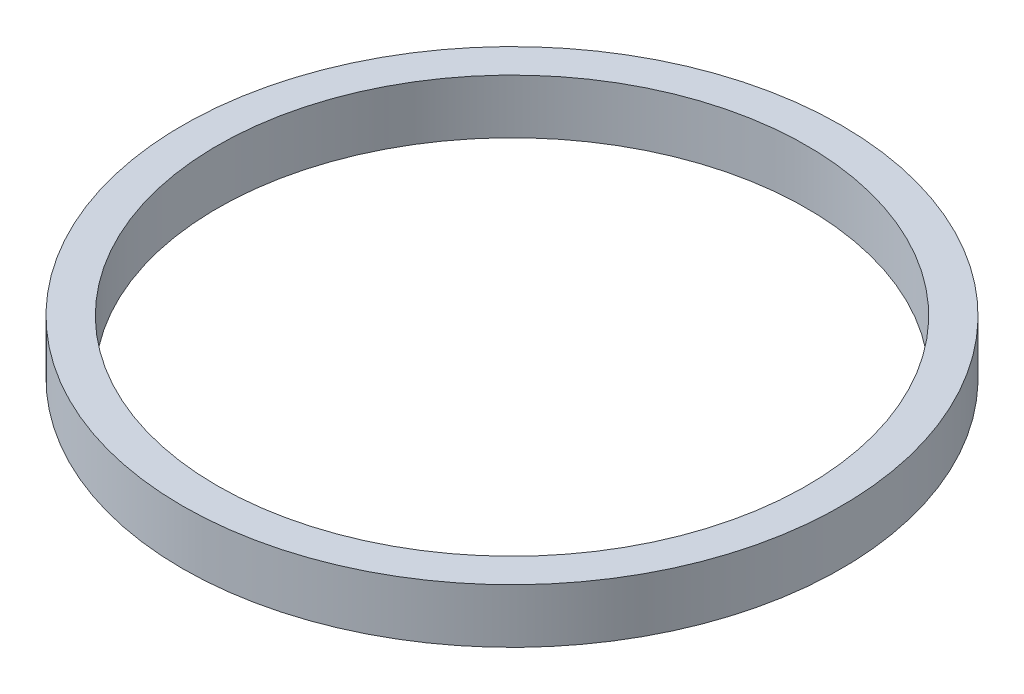
ISO-10303-21;
HEADER;
FILE_DESCRIPTION(('STEP AP214'),'2;1');
FILE_NAME('part.step','',(''),(''),'','','');
FILE_SCHEMA(('AUTOMOTIVE_DESIGN { 1 0 10303 214 1 1 1 1 }'));
ENDSEC;
DATA;
#1=APPLICATION_CONTEXT('core data for automotive mechanical design processes');
#2=APPLICATION_PROTOCOL_DEFINITION('international standard','automotive_design',2000,#1);
#3=PRODUCT_CONTEXT('',#1,'mechanical');
#4=PRODUCT('Part','Part','',(#3));
#5=PRODUCT_RELATED_PRODUCT_CATEGORY('part','',(#4));
#6=PRODUCT_DEFINITION_FORMATION('','',#4);
#7=PRODUCT_DEFINITION_CONTEXT('part definition',#1,'design');
#8=PRODUCT_DEFINITION('design','',#6,#7);
#9=PRODUCT_DEFINITION_SHAPE('','',#8);
#10=(LENGTH_UNIT() NAMED_UNIT(*) SI_UNIT(.MILLI.,.METRE.));
#11=(NAMED_UNIT(*) PLANE_ANGLE_UNIT() SI_UNIT($,.RADIAN.));
#12=(NAMED_UNIT(*) SI_UNIT($,.STERADIAN.) SOLID_ANGLE_UNIT());
#13=UNCERTAINTY_MEASURE_WITH_UNIT(LENGTH_MEASURE(1.E-05),#10,'distance_accuracy_value','');
#14=(GEOMETRIC_REPRESENTATION_CONTEXT(3) GLOBAL_UNCERTAINTY_ASSIGNED_CONTEXT((#13)) GLOBAL_UNIT_ASSIGNED_CONTEXT((#10,
#11,#12)) REPRESENTATION_CONTEXT('',''));
#15=CARTESIAN_POINT('',(0.,0.,0.));
#16=DIRECTION('',(0.,0.,1.));
#17=DIRECTION('',(1.,0.,0.));
#18=AXIS2_PLACEMENT_3D('',#15,#16,#17);
#19=CARTESIAN_POINT('',(0.,7.,0.));
#20=DIRECTION('',(0.,1.,0.));
#21=DIRECTION('',(0.,0.,1.));
#22=AXIS2_PLACEMENT_3D('',#19,#20,#21);
#23=PLANE('',#22);
#24=CARTESIAN_POINT('',(0.,7.,0.));
#25=DIRECTION('',(0.,1.,0.));
#26=DIRECTION('',(0.,0.,1.));
#27=AXIS2_PLACEMENT_3D('',#24,#25,#26);
#28=CIRCLE('',#27,42.5);
#29=CARTESIAN_POINT('',(0.,7.,42.5));
#30=VERTEX_POINT('',#29);
#31=EDGE_CURVE('E10',#30,#30,#28,.T.);
#32=ORIENTED_EDGE('',*,*,#31,.T.);
#33=EDGE_LOOP('',(#32));
#34=FACE_BOUND('',#33,.T.);
#35=CARTESIAN_POINT('',(0.,7.,0.));
#36=DIRECTION('',(0.,1.,0.));
#37=DIRECTION('',(0.,0.,1.));
#38=AXIS2_PLACEMENT_3D('',#35,#36,#37);
#39=CIRCLE('',#38,38.);
#40=CARTESIAN_POINT('',(0.,7.,38.));
#41=VERTEX_POINT('',#40);
#42=EDGE_CURVE('E46',#41,#41,#39,.T.);
#43=ORIENTED_EDGE('',*,*,#42,.F.);
#44=EDGE_LOOP('',(#43));
#45=FACE_BOUND('',#44,.T.);
#46=ADVANCED_FACE('F35',(#34,#45),#23,.T.);
#47=CARTESIAN_POINT('',(0.,0.,0.));
#48=DIRECTION('',(0.,1.,0.));
#49=DIRECTION('',(0.,0.,1.));
#50=AXIS2_PLACEMENT_3D('',#47,#48,#49);
#51=PLANE('',#50);
#52=CARTESIAN_POINT('',(0.,0.,0.));
#53=DIRECTION('',(0.,1.,0.));
#54=DIRECTION('',(0.,0.,1.));
#55=AXIS2_PLACEMENT_3D('',#52,#53,#54);
#56=CIRCLE('',#55,42.5);
#57=CARTESIAN_POINT('',(0.,0.,42.5));
#58=VERTEX_POINT('',#57);
#59=EDGE_CURVE('E39',#58,#58,#56,.T.);
#60=ORIENTED_EDGE('',*,*,#59,.F.);
#61=EDGE_LOOP('',(#60));
#62=FACE_BOUND('',#61,.T.);
#63=CARTESIAN_POINT('',(0.,0.,0.));
#64=DIRECTION('',(0.,1.,0.));
#65=DIRECTION('',(0.,0.,1.));
#66=AXIS2_PLACEMENT_3D('',#63,#64,#65);
#67=CIRCLE('',#66,38.);
#68=CARTESIAN_POINT('',(0.,0.,38.));
#69=VERTEX_POINT('',#68);
#70=EDGE_CURVE('E48',#69,#69,#67,.T.);
#71=ORIENTED_EDGE('',*,*,#70,.T.);
#72=EDGE_LOOP('',(#71));
#73=FACE_BOUND('',#72,.T.);
#74=ADVANCED_FACE('F58',(#62,#73),#51,.F.);
#75=CARTESIAN_POINT('',(0.,7.,0.));
#76=DIRECTION('',(0.,-1.,0.));
#77=DIRECTION('',(0.,0.,-1.));
#78=AXIS2_PLACEMENT_3D('',#75,#76,#77);
#79=CYLINDRICAL_SURFACE('',#78,42.5);
#80=ORIENTED_EDGE('',*,*,#31,.F.);
#81=EDGE_LOOP('',(#80));
#82=FACE_BOUND('',#81,.T.);
#83=ORIENTED_EDGE('',*,*,#59,.T.);
#84=EDGE_LOOP('',(#83));
#85=FACE_BOUND('',#84,.T.);
#86=ADVANCED_FACE('F37',(#82,#85),#79,.T.);
#87=CARTESIAN_POINT('',(0.,7.,0.));
#88=DIRECTION('',(0.,-1.,0.));
#89=DIRECTION('',(0.,0.,-1.));
#90=AXIS2_PLACEMENT_3D('',#87,#88,#89);
#91=CYLINDRICAL_SURFACE('',#90,38.);
#92=ORIENTED_EDGE('',*,*,#42,.T.);
#93=EDGE_LOOP('',(#92));
#94=FACE_BOUND('',#93,.T.);
#95=ORIENTED_EDGE('',*,*,#70,.F.);
#96=EDGE_LOOP('',(#95));
#97=FACE_BOUND('',#96,.T.);
#98=ADVANCED_FACE('F54',(#94,#97),#91,.F.);
#99=CLOSED_SHELL('',(#46,#74,#86,#98));
#100=MANIFOLD_SOLID_BREP('B2',#99);
#101=ADVANCED_BREP_SHAPE_REPRESENTATION('',(#18,#100),#14);
#102=SHAPE_DEFINITION_REPRESENTATION(#9,#101);
ENDSEC;
END-ISO-10303-21;
